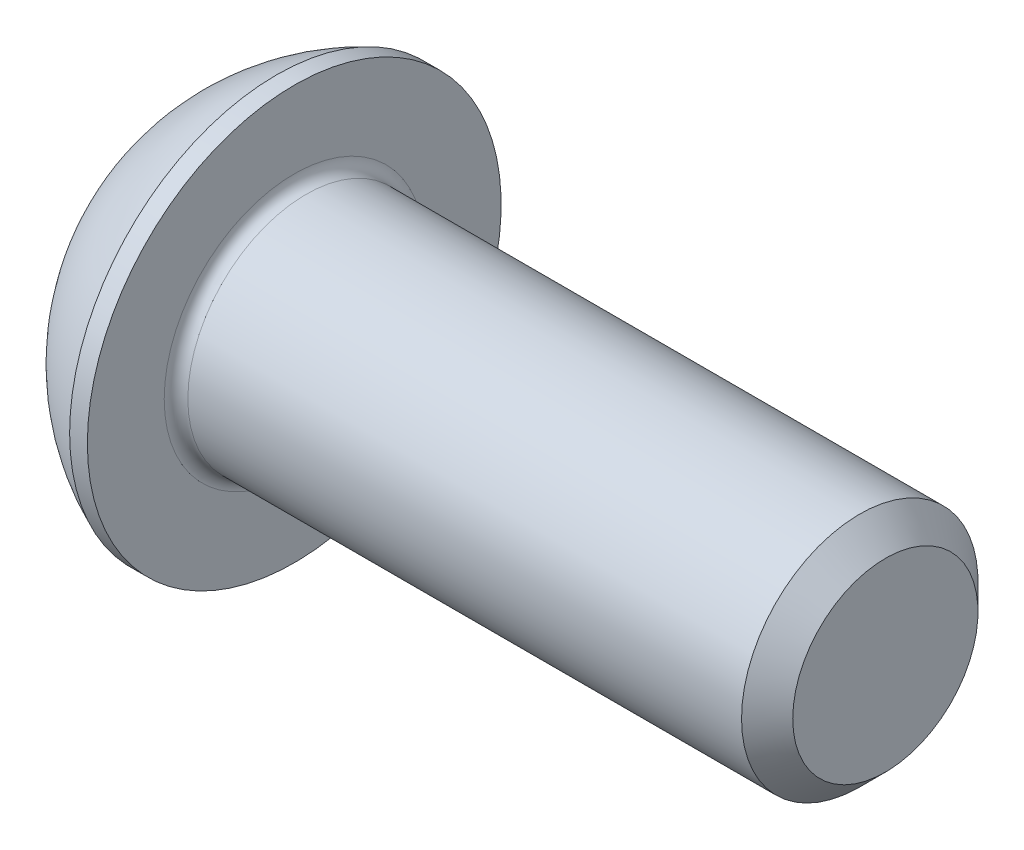
ISO-10303-21;
HEADER;
FILE_DESCRIPTION(('STEP AP214'),'2;1');
FILE_NAME('part.step','',(''),(''),'','','');
FILE_SCHEMA(('AUTOMOTIVE_DESIGN { 1 0 10303 214 1 1 1 1 }'));
ENDSEC;
DATA;
#1=APPLICATION_CONTEXT('core data for automotive mechanical design processes');
#2=APPLICATION_PROTOCOL_DEFINITION('international standard','automotive_design',2000,#1);
#3=PRODUCT_CONTEXT('',#1,'mechanical');
#4=PRODUCT('Part','Part','',(#3));
#5=PRODUCT_RELATED_PRODUCT_CATEGORY('part','',(#4));
#6=PRODUCT_DEFINITION_FORMATION('','',#4);
#7=PRODUCT_DEFINITION_CONTEXT('part definition',#1,'design');
#8=PRODUCT_DEFINITION('design','',#6,#7);
#9=PRODUCT_DEFINITION_SHAPE('','',#8);
#10=(LENGTH_UNIT() NAMED_UNIT(*) SI_UNIT(.MILLI.,.METRE.));
#11=(NAMED_UNIT(*) PLANE_ANGLE_UNIT() SI_UNIT($,.RADIAN.));
#12=(NAMED_UNIT(*) SI_UNIT($,.STERADIAN.) SOLID_ANGLE_UNIT());
#13=UNCERTAINTY_MEASURE_WITH_UNIT(LENGTH_MEASURE(1.E-05),#10,'distance_accuracy_value','');
#14=(GEOMETRIC_REPRESENTATION_CONTEXT(3) GLOBAL_UNCERTAINTY_ASSIGNED_CONTEXT((#13)) GLOBAL_UNIT_ASSIGNED_CONTEXT((#10,
#11,#12)) REPRESENTATION_CONTEXT('',''));
#15=CARTESIAN_POINT('',(0.,0.,0.));
#16=DIRECTION('',(0.,0.,1.));
#17=DIRECTION('',(1.,0.,0.));
#18=AXIS2_PLACEMENT_3D('',#15,#16,#17);
#19=CARTESIAN_POINT('',(0.,0.,0.));
#20=DIRECTION('',(-1.,0.,0.));
#21=DIRECTION('',(0.,0.,1.));
#22=AXIS2_PLACEMENT_3D('',#19,#20,#21);
#23=PLANE('',#22);
#24=CARTESIAN_POINT('',(0.,0.,0.));
#25=DIRECTION('',(-1.,0.,0.));
#26=DIRECTION('',(0.,0.,1.));
#27=AXIS2_PLACEMENT_3D('',#24,#25,#26);
#28=CIRCLE('',#27,0.875);
#29=CARTESIAN_POINT('',(0.,0.875,0.));
#30=VERTEX_POINT('',#29);
#31=EDGE_CURVE('E255',#30,#30,#28,.T.);
#32=ORIENTED_EDGE('',*,*,#31,.T.);
#33=EDGE_LOOP('',(#32));
#34=FACE_BOUND('',#33,.T.);
#35=CARTESIAN_POINT('',(0.,0.,0.));
#36=DIRECTION('',(-1.,0.,0.));
#37=DIRECTION('',(0.,0.,1.));
#38=AXIS2_PLACEMENT_3D('',#35,#36,#37);
#39=CIRCLE('',#38,0.715);
#40=CARTESIAN_POINT('',(0.,-0.711850222545951,0.0670392471711933));
#41=VERTEX_POINT('',#40);
#42=CARTESIAN_POINT('',(0.,-0.413982802373816,0.582960752828801));
#43=VERTEX_POINT('',#42);
#44=EDGE_CURVE('E238',#41,#43,#39,.T.);
#45=ORIENTED_EDGE('',*,*,#44,.F.);
#46=DIRECTION('',(0.,-0.499999999999998,-0.86602540378444));
#47=VECTOR('',#46,1.);
#48=CARTESIAN_POINT('',(0.,-0.750555349946509,0.));
#49=LINE('',#48,#47);
#50=CARTESIAN_POINT('',(0.,-0.750555349946509,0.));
#51=VERTEX_POINT('',#50);
#52=EDGE_CURVE('E436',#41,#51,#49,.T.);
#53=ORIENTED_EDGE('',*,*,#52,.T.);
#54=DIRECTION('',(0.,0.499999999999995,-0.866025403784441));
#55=VECTOR('',#54,1.);
#56=CARTESIAN_POINT('',(0.,-0.375277674973257,-0.65));
#57=LINE('',#56,#55);
#58=CARTESIAN_POINT('',(0.,-0.711850222545951,-0.0670392471711938));
#59=VERTEX_POINT('',#58);
#60=EDGE_CURVE('E188',#51,#59,#57,.T.);
#61=ORIENTED_EDGE('',*,*,#60,.T.);
#62=CARTESIAN_POINT('',(0.,-0.41398280237382,-0.582960752828798));
#63=VERTEX_POINT('',#62);
#64=EDGE_CURVE('E465',#63,#59,#39,.T.);
#65=ORIENTED_EDGE('',*,*,#64,.F.);
#66=CARTESIAN_POINT('',(0.,-0.375277674973257,-0.65));
#67=VERTEX_POINT('',#66);
#68=EDGE_CURVE('E435',#63,#67,#57,.T.);
#69=ORIENTED_EDGE('',*,*,#68,.T.);
#70=DIRECTION('',(0.,1.,0.));
#71=VECTOR('',#70,1.);
#72=CARTESIAN_POINT('',(0.,0.375277674973258,-0.65));
#73=LINE('',#72,#71);
#74=CARTESIAN_POINT('',(0.,-0.29786742017213,-0.65));
#75=VERTEX_POINT('',#74);
#76=EDGE_CURVE('E427',#67,#75,#73,.T.);
#77=ORIENTED_EDGE('',*,*,#76,.T.);
#78=CARTESIAN_POINT('',(0.,0.29786742017213,-0.65));
#79=VERTEX_POINT('',#78);
#80=EDGE_CURVE('E429',#79,#75,#39,.T.);
#81=ORIENTED_EDGE('',*,*,#80,.F.);
#82=CARTESIAN_POINT('',(0.,0.375277674973258,-0.65));
#83=VERTEX_POINT('',#82);
#84=EDGE_CURVE('E417',#79,#83,#73,.T.);
#85=ORIENTED_EDGE('',*,*,#84,.T.);
#86=DIRECTION('',(0.,0.499999999999999,0.866025403784439));
#87=VECTOR('',#86,1.);
#88=CARTESIAN_POINT('',(0.,0.750555349946514,0.));
#89=LINE('',#88,#87);
#90=CARTESIAN_POINT('',(0.,0.413982802373822,-0.582960752828797));
#91=VERTEX_POINT('',#90);
#92=EDGE_CURVE('E422',#83,#91,#89,.T.);
#93=ORIENTED_EDGE('',*,*,#92,.T.);
#94=CARTESIAN_POINT('',(0.,0.71185022254595,-0.0670392471712036));
#95=VERTEX_POINT('',#94);
#96=EDGE_CURVE('E467',#95,#91,#39,.T.);
#97=ORIENTED_EDGE('',*,*,#96,.F.);
#98=CARTESIAN_POINT('',(0.,0.750555349946514,0.));
#99=VERTEX_POINT('',#98);
#100=EDGE_CURVE('E424',#95,#99,#89,.T.);
#101=ORIENTED_EDGE('',*,*,#100,.T.);
#102=DIRECTION('',(0.,-0.500000000000001,0.866025403784438));
#103=VECTOR('',#102,1.);
#104=CARTESIAN_POINT('',(0.,0.375277674973258,0.649999999999998));
#105=LINE('',#104,#103);
#106=CARTESIAN_POINT('',(0.,0.71185022254595,0.0670392471712033));
#107=VERTEX_POINT('',#106);
#108=EDGE_CURVE('E407',#99,#107,#105,.T.);
#109=ORIENTED_EDGE('',*,*,#108,.T.);
#110=CARTESIAN_POINT('',(0.,0.41398280237382,0.582960752828798));
#111=VERTEX_POINT('',#110);
#112=EDGE_CURVE('E237',#111,#107,#39,.T.);
#113=ORIENTED_EDGE('',*,*,#112,.F.);
#114=CARTESIAN_POINT('',(0.,0.375277674973258,0.649999999999998));
#115=VERTEX_POINT('',#114);
#116=EDGE_CURVE('E403',#111,#115,#105,.T.);
#117=ORIENTED_EDGE('',*,*,#116,.T.);
#118=DIRECTION('',(0.,-1.,0.));
#119=VECTOR('',#118,1.);
#120=CARTESIAN_POINT('',(0.,-0.375277674973256,0.649999999999997));
#121=LINE('',#120,#119);
#122=CARTESIAN_POINT('',(0.,0.297867420172135,0.649999999999998));
#123=VERTEX_POINT('',#122);
#124=EDGE_CURVE('E176',#115,#123,#121,.T.);
#125=ORIENTED_EDGE('',*,*,#124,.T.);
#126=CARTESIAN_POINT('',(0.,-0.297867420172137,0.649999999999997));
#127=VERTEX_POINT('',#126);
#128=EDGE_CURVE('E234',#127,#123,#39,.T.);
#129=ORIENTED_EDGE('',*,*,#128,.F.);
#130=CARTESIAN_POINT('',(0.,-0.375277674973256,0.649999999999997));
#131=VERTEX_POINT('',#130);
#132=EDGE_CURVE('E401',#127,#131,#121,.T.);
#133=ORIENTED_EDGE('',*,*,#132,.T.);
#134=EDGE_CURVE('E434',#131,#43,#49,.T.);
#135=ORIENTED_EDGE('',*,*,#134,.T.);
#136=EDGE_LOOP('',(#45,#53,#61,#65,#69,#77,#81,#85,#93,#97,#101,#109,#113,#117,#125,#129,#133,#135));
#137=FACE_BOUND('',#136,.T.);
#138=ADVANCED_FACE('F41',(#34,#137),#23,.T.);
#139=CARTESIAN_POINT('',(0.,0.,0.));
#140=DIRECTION('',(-1.,0.,0.));
#141=DIRECTION('',(0.,0.,1.));
#142=AXIS2_PLACEMENT_3D('',#139,#140,#141);
#143=CYLINDRICAL_SURFACE('',#142,0.715);
#144=CARTESIAN_POINT('',(0.605,0.,0.));
#145=DIRECTION('',(-1.,0.,0.));
#146=DIRECTION('',(0.,0.,1.));
#147=AXIS2_PLACEMENT_3D('',#144,#145,#146);
#148=CIRCLE('',#147,0.715);
#149=CARTESIAN_POINT('',(0.605,-0.711850222545951,0.0670392471711933));
#150=VERTEX_POINT('',#149);
#151=CARTESIAN_POINT('',(0.605,-0.413982802373816,0.582960752828801));
#152=VERTEX_POINT('',#151);
#153=EDGE_CURVE('E459',#150,#152,#148,.T.);
#154=ORIENTED_EDGE('',*,*,#153,.F.);
#155=DIRECTION('',(-1.,0.,0.));
#156=VECTOR('',#155,1.);
#157=CARTESIAN_POINT('',(0.,-0.711850222545951,0.0670392471711937));
#158=LINE('',#157,#156);
#159=EDGE_CURVE('E173',#150,#41,#158,.T.);
#160=ORIENTED_EDGE('',*,*,#159,.T.);
#161=ORIENTED_EDGE('',*,*,#44,.T.);
#162=DIRECTION('',(-1.,0.,0.));
#163=VECTOR('',#162,1.);
#164=CARTESIAN_POINT('',(0.,-0.413982802373816,0.582960752828801));
#165=LINE('',#164,#163);
#166=EDGE_CURVE('E228',#43,#152,#165,.F.);
#167=ORIENTED_EDGE('',*,*,#166,.T.);
#168=EDGE_LOOP('',(#154,#160,#161,#167));
#169=FACE_BOUND('',#168,.T.);
#170=ADVANCED_FACE('F277',(#169),#143,.F.);
#171=CARTESIAN_POINT('',(0.605,-0.41398280237382,-0.582960752828798));
#172=VERTEX_POINT('',#171);
#173=CARTESIAN_POINT('',(0.605,-0.711850222545951,-0.0670392471711938));
#174=VERTEX_POINT('',#173);
#175=EDGE_CURVE('E455',#172,#174,#148,.T.);
#176=ORIENTED_EDGE('',*,*,#175,.F.);
#177=DIRECTION('',(-1.,0.,0.));
#178=VECTOR('',#177,1.);
#179=CARTESIAN_POINT('',(0.,-0.41398280237382,-0.582960752828798));
#180=LINE('',#179,#178);
#181=EDGE_CURVE('E222',#172,#63,#180,.T.);
#182=ORIENTED_EDGE('',*,*,#181,.T.);
#183=ORIENTED_EDGE('',*,*,#64,.T.);
#184=DIRECTION('',(-1.,0.,0.));
#185=VECTOR('',#184,1.);
#186=CARTESIAN_POINT('',(0.,-0.711850222545951,-0.0670392471711937));
#187=LINE('',#186,#185);
#188=EDGE_CURVE('E221',#59,#174,#187,.F.);
#189=ORIENTED_EDGE('',*,*,#188,.T.);
#190=EDGE_LOOP('',(#176,#182,#183,#189));
#191=FACE_BOUND('',#190,.T.);
#192=ADVANCED_FACE('F284',(#191),#143,.F.);
#193=CARTESIAN_POINT('',(0.605,0.29786742017213,-0.65));
#194=VERTEX_POINT('',#193);
#195=CARTESIAN_POINT('',(0.605,-0.29786742017213,-0.65));
#196=VERTEX_POINT('',#195);
#197=EDGE_CURVE('E453',#194,#196,#148,.T.);
#198=ORIENTED_EDGE('',*,*,#197,.F.);
#199=DIRECTION('',(-1.,0.,0.));
#200=VECTOR('',#199,1.);
#201=CARTESIAN_POINT('',(0.,0.29786742017213,-0.65));
#202=LINE('',#201,#200);
#203=EDGE_CURVE('E217',#194,#79,#202,.T.);
#204=ORIENTED_EDGE('',*,*,#203,.T.);
#205=ORIENTED_EDGE('',*,*,#80,.T.);
#206=DIRECTION('',(-1.,0.,0.));
#207=VECTOR('',#206,1.);
#208=CARTESIAN_POINT('',(0.,-0.29786742017213,-0.65));
#209=LINE('',#208,#207);
#210=EDGE_CURVE('E215',#75,#196,#209,.F.);
#211=ORIENTED_EDGE('',*,*,#210,.T.);
#212=EDGE_LOOP('',(#198,#204,#205,#211));
#213=FACE_BOUND('',#212,.T.);
#214=ADVANCED_FACE('F475',(#213),#143,.F.);
#215=CARTESIAN_POINT('',(0.605,0.71185022254595,-0.0670392471712036));
#216=VERTEX_POINT('',#215);
#217=CARTESIAN_POINT('',(0.605,0.413982802373822,-0.582960752828797));
#218=VERTEX_POINT('',#217);
#219=EDGE_CURVE('E375',#216,#218,#148,.T.);
#220=ORIENTED_EDGE('',*,*,#219,.F.);
#221=DIRECTION('',(-1.,0.,0.));
#222=VECTOR('',#221,1.);
#223=CARTESIAN_POINT('',(0.,0.71185022254595,-0.0670392471712036));
#224=LINE('',#223,#222);
#225=EDGE_CURVE('E212',#216,#95,#224,.T.);
#226=ORIENTED_EDGE('',*,*,#225,.T.);
#227=ORIENTED_EDGE('',*,*,#96,.T.);
#228=DIRECTION('',(-1.,0.,0.));
#229=VECTOR('',#228,1.);
#230=CARTESIAN_POINT('',(0.,0.413982802373822,-0.582960752828797));
#231=LINE('',#230,#229);
#232=EDGE_CURVE('E209',#91,#218,#231,.F.);
#233=ORIENTED_EDGE('',*,*,#232,.T.);
#234=EDGE_LOOP('',(#220,#226,#227,#233));
#235=FACE_BOUND('',#234,.T.);
#236=ADVANCED_FACE('F468',(#235),#143,.F.);
#237=CARTESIAN_POINT('',(0.605,0.41398280237382,0.582960752828798));
#238=VERTEX_POINT('',#237);
#239=CARTESIAN_POINT('',(0.605,0.71185022254595,0.0670392471712033));
#240=VERTEX_POINT('',#239);
#241=EDGE_CURVE('E232',#238,#240,#148,.T.);
#242=ORIENTED_EDGE('',*,*,#241,.F.);
#243=DIRECTION('',(-1.,0.,0.));
#244=VECTOR('',#243,1.);
#245=CARTESIAN_POINT('',(0.,0.41398280237382,0.582960752828798));
#246=LINE('',#245,#244);
#247=EDGE_CURVE('E207',#238,#111,#246,.T.);
#248=ORIENTED_EDGE('',*,*,#247,.T.);
#249=ORIENTED_EDGE('',*,*,#112,.T.);
#250=DIRECTION('',(-1.,0.,0.));
#251=VECTOR('',#250,1.);
#252=CARTESIAN_POINT('',(0.,0.71185022254595,0.0670392471712036));
#253=LINE('',#252,#251);
#254=EDGE_CURVE('E202',#107,#240,#253,.F.);
#255=ORIENTED_EDGE('',*,*,#254,.T.);
#256=EDGE_LOOP('',(#242,#248,#249,#255));
#257=FACE_BOUND('',#256,.T.);
#258=ADVANCED_FACE('F385',(#257),#143,.F.);
#259=CARTESIAN_POINT('',(0.605,-0.297867420172137,0.649999999999997));
#260=VERTEX_POINT('',#259);
#261=CARTESIAN_POINT('',(0.605,0.297867420172135,0.649999999999998));
#262=VERTEX_POINT('',#261);
#263=EDGE_CURVE('E229',#260,#262,#148,.T.);
#264=ORIENTED_EDGE('',*,*,#263,.F.);
#265=DIRECTION('',(-1.,0.,0.));
#266=VECTOR('',#265,1.);
#267=CARTESIAN_POINT('',(0.,-0.297867420172137,0.649999999999997));
#268=LINE('',#267,#266);
#269=EDGE_CURVE('E195',#260,#127,#268,.T.);
#270=ORIENTED_EDGE('',*,*,#269,.T.);
#271=ORIENTED_EDGE('',*,*,#128,.T.);
#272=DIRECTION('',(-1.,0.,0.));
#273=VECTOR('',#272,1.);
#274=CARTESIAN_POINT('',(0.,0.297867420172135,0.649999999999998));
#275=LINE('',#274,#273);
#276=EDGE_CURVE('E191',#123,#262,#275,.F.);
#277=ORIENTED_EDGE('',*,*,#276,.T.);
#278=EDGE_LOOP('',(#264,#270,#271,#277));
#279=FACE_BOUND('',#278,.T.);
#280=ADVANCED_FACE('F281',(#279),#143,.F.);
#281=CARTESIAN_POINT('',(1.68388157894737,0.,0.));
#282=DIRECTION('',(-1.,0.,0.));
#283=DIRECTION('',(0.,1.,0.));
#284=AXIS2_PLACEMENT_3D('',#281,#282,#283);
#285=SPHERICAL_SURFACE('',#284,1.89765175201308);
#286=CARTESIAN_POINT('',(0.95,0.,0.));
#287=DIRECTION('',(-1.,0.,0.));
#288=DIRECTION('',(0.,0.,1.));
#289=AXIS2_PLACEMENT_3D('',#286,#287,#288);
#290=CIRCLE('',#289,1.75);
#291=CARTESIAN_POINT('',(0.95,1.75,0.));
#292=VERTEX_POINT('',#291);
#293=EDGE_CURVE('E248',#292,#292,#290,.T.);
#294=CARTESIAN_POINT('',(0.95,1.75,0.));
#295=CARTESIAN_POINT('',(0.937340169559538,1.74469098940027,0.));
#296=CARTESIAN_POINT('',(0.924737968908448,1.73924455835412,0.));
#297=CARTESIAN_POINT('',(0.899654717595099,1.72807952164054,0.));
#298=CARTESIAN_POINT('',(0.887173666932838,1.7223609159731,0.));
#299=CARTESIAN_POINT('',(0.862338606007229,1.7106541962885,0.));
#300=CARTESIAN_POINT('',(0.849984595743881,1.70466608227132,0.));
#301=CARTESIAN_POINT('',(0.825409430903376,1.69242317344065,0.));
#302=CARTESIAN_POINT('',(0.81318827632622,1.68616837862716,0.));
#303=CARTESIAN_POINT('',(0.788884579669412,1.67339505215556,0.));
#304=CARTESIAN_POINT('',(0.77680203758976,1.66687652049746,0.));
#305=CARTESIAN_POINT('',(0.752781256357558,1.65357879096983,0.));
#306=CARTESIAN_POINT('',(0.740843017205007,1.64679959310029,0.));
#307=CARTESIAN_POINT('',(0.71711646458663,1.63298372389127,0.));
#308=CARTESIAN_POINT('',(0.705328151120803,1.6259470525518,0.));
#309=CARTESIAN_POINT('',(0.681907001944365,1.61161955058688,0.));
#310=CARTESIAN_POINT('',(0.670274166233754,1.60432871996143,0.));
#311=CARTESIAN_POINT('',(0.647169451430108,1.58949633326558,0.));
#312=CARTESIAN_POINT('',(0.635697572337074,1.58195477719518,0.));
#313=CARTESIAN_POINT('',(0.612920173817592,1.56662449155034,0.));
#314=CARTESIAN_POINT('',(0.601614654391145,1.55883576197591,0.));
#315=CARTESIAN_POINT('',(0.579175299902932,1.54301479767485,0.));
#316=CARTESIAN_POINT('',(0.568041464841166,1.53498256294822,0.));
#317=CARTESIAN_POINT('',(0.545950722919735,1.51867837138209,0.));
#318=CARTESIAN_POINT('',(0.534993816060069,1.51040641454259,0.));
#319=CARTESIAN_POINT('',(0.51326209105034,1.49362667469462,0.));
#320=CARTESIAN_POINT('',(0.502487272900276,1.48511889168615,0.));
#321=CARTESIAN_POINT('',(0.481124800056695,1.46787150651415,0.));
#322=CARTESIAN_POINT('',(0.470537145363177,1.45913190435061,0.));
#323=CARTESIAN_POINT('',(0.449553986028991,1.44142499706503,0.));
#324=CARTESIAN_POINT('',(0.439158481388324,1.43245769194298,0.));
#325=CARTESIAN_POINT('',(0.418564518256898,1.41429960218096,0.));
#326=CARTESIAN_POINT('',(0.408366059766139,1.40510881754099,0.));
#327=CARTESIAN_POINT('',(0.388170992226373,1.38650809743857,0.));
#328=CARTESIAN_POINT('',(0.378174383177366,1.37709816197613,0.));
#329=CARTESIAN_POINT('',(0.35838772274546,1.35806357214034,0.));
#330=CARTESIAN_POINT('',(0.348597671362561,1.348438917767,0.));
#331=CARTESIAN_POINT('',(0.32922873720226,1.32897942314977,0.));
#332=CARTESIAN_POINT('',(0.319649854424858,1.31914458290588,0.));
#333=CARTESIAN_POINT('',(0.30070776895829,1.29926934858169,0.));
#334=CARTESIAN_POINT('',(0.291344566269124,1.28922895450139,0.));
#335=CARTESIAN_POINT('',(0.272838250880315,1.26894734135071,0.));
#336=CARTESIAN_POINT('',(0.263695138180673,1.25870612228032,0.));
#337=CARTESIAN_POINT('',(0.245633309013679,1.2380276825808,0.));
#338=CARTESIAN_POINT('',(0.236714592546328,1.22759046195167,0.));
#339=CARTESIAN_POINT('',(0.219105756400304,1.20652493487909,0.));
#340=CARTESIAN_POINT('',(0.21041563672163,1.19589662843564,0.));
#341=CARTESIAN_POINT('',(0.193268087043462,1.17445393547738,0.));
#342=CARTESIAN_POINT('',(0.184810657043969,1.16363954896256,0.));
#343=CARTESIAN_POINT('',(0.168132470025252,1.14182978924308,0.));
#344=CARTESIAN_POINT('',(0.159911713006028,1.13083441603841,0.));
#345=CARTESIAN_POINT('',(0.143710743767988,1.10866786156894,0.));
#346=CARTESIAN_POINT('',(0.135730531549171,1.09749668030414,0.));
#347=CARTESIAN_POINT('',(0.120014410485326,1.07498377112164,0.));
#348=CARTESIAN_POINT('',(0.112278501640297,1.06364204320393,0.));
#349=CARTESIAN_POINT('',(0.0970546306648887,1.04079338254035,0.));
#350=CARTESIAN_POINT('',(0.0895666685345088,1.02928644979447,0.));
#351=CARTESIAN_POINT('',(0.0748422181852083,1.00611279876044,0.));
#352=CARTESIAN_POINT('',(0.0676057299662877,0.994446080472284,0.));
#353=CARTESIAN_POINT('',(0.0533876338292878,0.970958354192094,0.));
#354=CARTESIAN_POINT('',(0.0464060259112086,0.959137346200057,0.));
#355=CARTESIAN_POINT('',(0.0327009855576053,0.935346604180128,0.));
#356=CARTESIAN_POINT('',(0.0259775531220811,0.923376870152236,0.));
#357=CARTESIAN_POINT('',(0.0127920043413564,0.899294327831803,0.));
#358=CARTESIAN_POINT('',(0.00632988799615577,0.887181519539262,0.));
#359=CARTESIAN_POINT('',(0.,0.875,0.));
#360=B_SPLINE_CURVE_WITH_KNOTS('',3,(#294,#295,#296,#297,#298,#299,#300,#301,#302,#303,#304,
#305,#306,#307,#308,#309,#310,#311,#312,#313,#314,#315,#316,#317,#318,#319,#320,#321,#322,#323,
#324,#325,#326,#327,#328,#329,#330,#331,#332,#333,#334,#335,#336,#337,#338,#339,#340,#341,#342,
#343,#344,#345,#346,#347,#348,#349,#350,#351,#352,#353,#354,#355,#356,#357,#358,#359),
.UNSPECIFIED.,.F.,.F.,(4,2,2,2,2,2,2,2,2,2,2,2,2,2,2,2,2,2,2,2,2,2,2,2,2,2,2,2,2,2,2,2,4),(0.,
0.0411830717721068,0.0823661435442138,0.12354921531632,0.164732287088427,0.205915358860534,
0.247098430632641,0.288281502404748,0.329464574176855,0.370647645948962,0.411830717721068,
0.453013789493175,0.494196861265282,0.535379933037389,0.576563004809496,0.617746076581603,
0.658929148353709,0.700112220125816,0.741295291897923,0.78247836367003,0.823661435442137,
0.864844507214244,0.906027578986351,0.947210650758457,0.988393722530564,1.02957679430267,
1.07075986607478,1.11194293784688,1.15312600961899,1.1943090813911,1.23549215316321,
1.27667522493531,1.31785829670742),.UNSPECIFIED.);
#361=EDGE_CURVE('BSEAM287',#292,#30,#360,.T.);
#362=ORIENTED_EDGE('',*,*,#293,.T.);
#363=ORIENTED_EDGE('',*,*,#31,.F.);
#364=ORIENTED_EDGE('',*,*,#361,.T.);
#365=ORIENTED_EDGE('',*,*,#361,.F.);
#366=EDGE_LOOP('',(#362,#364,#363,#365));
#367=FACE_BOUND('',#366,.T.);
#368=ADVANCED_FACE('F287',(#367),#285,.T.);
#369=CARTESIAN_POINT('',(0.,0.,0.));
#370=DIRECTION('',(-1.,0.,0.));
#371=DIRECTION('',(0.,0.,1.));
#372=AXIS2_PLACEMENT_3D('',#369,#370,#371);
#373=CYLINDRICAL_SURFACE('',#372,1.75);
#374=ORIENTED_EDGE('',*,*,#293,.F.);
#375=EDGE_LOOP('',(#374));
#376=FACE_BOUND('',#375,.T.);
#377=CARTESIAN_POINT('',(1.1,0.,0.));
#378=DIRECTION('',(-1.,0.,0.));
#379=DIRECTION('',(0.,0.,1.));
#380=AXIS2_PLACEMENT_3D('',#377,#378,#379);
#381=CIRCLE('',#380,1.75);
#382=CARTESIAN_POINT('',(1.1,0.,1.75));
#383=VERTEX_POINT('',#382);
#384=EDGE_CURVE('E246',#383,#383,#381,.T.);
#385=ORIENTED_EDGE('',*,*,#384,.T.);
#386=EDGE_LOOP('',(#385));
#387=FACE_BOUND('',#386,.T.);
#388=ADVANCED_FACE('F293',(#376,#387),#373,.T.);
#389=CARTESIAN_POINT('',(1.1,0.999999999999992,0.));
#390=DIRECTION('',(-1.,0.,0.));
#391=DIRECTION('',(0.,0.,1.));
#392=AXIS2_PLACEMENT_3D('',#389,#390,#391);
#393=PLANE('',#392);
#394=CARTESIAN_POINT('',(1.1,0.,0.));
#395=DIRECTION('',(-1.,0.,0.));
#396=DIRECTION('',(0.,0.,1.));
#397=AXIS2_PLACEMENT_3D('',#394,#395,#396);
#398=CIRCLE('',#397,1.09999999999999);
#399=CARTESIAN_POINT('',(1.1,0.,1.09999999999999));
#400=VERTEX_POINT('',#399);
#401=EDGE_CURVE('E47',#400,#400,#398,.T.);
#402=ORIENTED_EDGE('',*,*,#401,.T.);
#403=EDGE_LOOP('',(#402));
#404=FACE_BOUND('',#403,.T.);
#405=ORIENTED_EDGE('',*,*,#384,.F.);
#406=EDGE_LOOP('',(#405));
#407=FACE_BOUND('',#406,.T.);
#408=ADVANCED_FACE('F257',(#404,#407),#393,.F.);
#409=CARTESIAN_POINT('',(0.,0.,0.));
#410=DIRECTION('',(-1.,0.,0.));
#411=DIRECTION('',(0.,0.,1.));
#412=AXIS2_PLACEMENT_3D('',#409,#410,#411);
#413=CYLINDRICAL_SURFACE('',#412,0.999999999999992);
#414=CARTESIAN_POINT('',(1.2,0.,0.));
#415=DIRECTION('',(-1.,0.,0.));
#416=DIRECTION('',(0.,0.,1.));
#417=AXIS2_PLACEMENT_3D('',#414,#415,#416);
#418=CIRCLE('',#417,0.999999999999992);
#419=CARTESIAN_POINT('',(1.2,0.,0.999999999999992));
#420=VERTEX_POINT('',#419);
#421=EDGE_CURVE('E11',#420,#420,#418,.F.);
#422=ORIENTED_EDGE('',*,*,#421,.T.);
#423=EDGE_LOOP('',(#422));
#424=FACE_BOUND('',#423,.T.);
#425=CARTESIAN_POINT('',(5.8835,0.,0.));
#426=DIRECTION('',(-1.,0.,0.));
#427=DIRECTION('',(0.,0.,1.));
#428=AXIS2_PLACEMENT_3D('',#425,#426,#427);
#429=CIRCLE('',#428,0.999999999999992);
#430=CARTESIAN_POINT('',(5.8835,0.,0.999999999999992));
#431=VERTEX_POINT('',#430);
#432=EDGE_CURVE('E243',#431,#431,#429,.T.);
#433=ORIENTED_EDGE('',*,*,#432,.T.);
#434=EDGE_LOOP('',(#433));
#435=FACE_BOUND('',#434,.T.);
#436=ADVANCED_FACE('F296',(#424,#435),#413,.T.);
#437=CARTESIAN_POINT('',(6.09999999999999,0.,0.));
#438=DIRECTION('',(-1.,0.,0.));
#439=DIRECTION('',(0.,0.,1.));
#440=AXIS2_PLACEMENT_3D('',#437,#438,#439);
#441=CONICAL_SURFACE('',#440,0.7835,0.785398163397442);
#442=ORIENTED_EDGE('',*,*,#432,.F.);
#443=EDGE_LOOP('',(#442));
#444=FACE_BOUND('',#443,.T.);
#445=CARTESIAN_POINT('',(6.09999999999999,0.,0.));
#446=DIRECTION('',(-1.,0.,0.));
#447=DIRECTION('',(0.,0.,1.));
#448=AXIS2_PLACEMENT_3D('',#445,#446,#447);
#449=CIRCLE('',#448,0.7835);
#450=CARTESIAN_POINT('',(6.09999999999999,0.,0.7835));
#451=VERTEX_POINT('',#450);
#452=EDGE_CURVE('E239',#451,#451,#449,.T.);
#453=ORIENTED_EDGE('',*,*,#452,.T.);
#454=EDGE_LOOP('',(#453));
#455=FACE_BOUND('',#454,.T.);
#456=ADVANCED_FACE('F271',(#444,#455),#441,.T.);
#457=CARTESIAN_POINT('',(6.09999999999999,0.,0.));
#458=DIRECTION('',(-1.,0.,0.));
#459=DIRECTION('',(0.,0.,1.));
#460=AXIS2_PLACEMENT_3D('',#457,#458,#459);
#461=PLANE('',#460);
#462=ORIENTED_EDGE('',*,*,#452,.F.);
#463=EDGE_LOOP('',(#462));
#464=FACE_BOUND('',#463,.T.);
#465=ADVANCED_FACE('F264',(#464),#461,.F.);
#466=CARTESIAN_POINT('',(1.2,0.,0.));
#467=DIRECTION('',(-1.,0.,0.));
#468=DIRECTION('',(0.,0.,1.));
#469=AXIS2_PLACEMENT_3D('',#466,#467,#468);
#470=TOROIDAL_SURFACE('',#469,1.09999999999999,0.1);
#471=ORIENTED_EDGE('',*,*,#421,.F.);
#472=EDGE_LOOP('',(#471));
#473=FACE_BOUND('',#472,.T.);
#474=ORIENTED_EDGE('',*,*,#401,.F.);
#475=EDGE_LOOP('',(#474));
#476=FACE_BOUND('',#475,.T.);
#477=ADVANCED_FACE('F43',(#473,#476),#470,.F.);
#478=CARTESIAN_POINT('',(1.01780544247059,0.,0.));
#479=DIRECTION('',(-1.,0.,0.));
#480=DIRECTION('',(0.,0.,1.));
#481=AXIS2_PLACEMENT_3D('',#478,#479,#480);
#482=CONICAL_SURFACE('',#481,0.,1.04719755119659);
#483=EDGE_CURVE('E233',#262,#238,#148,.T.);
#484=ORIENTED_EDGE('',*,*,#483,.T.);
#485=ORIENTED_EDGE('',*,*,#241,.T.);
#486=EDGE_CURVE('E362',#240,#216,#148,.T.);
#487=ORIENTED_EDGE('',*,*,#486,.T.);
#488=ORIENTED_EDGE('',*,*,#219,.T.);
#489=EDGE_CURVE('E458',#218,#194,#148,.T.);
#490=ORIENTED_EDGE('',*,*,#489,.T.);
#491=ORIENTED_EDGE('',*,*,#197,.T.);
#492=EDGE_CURVE('E451',#196,#172,#148,.T.);
#493=ORIENTED_EDGE('',*,*,#492,.T.);
#494=ORIENTED_EDGE('',*,*,#175,.T.);
#495=EDGE_CURVE('E185',#174,#150,#148,.T.);
#496=ORIENTED_EDGE('',*,*,#495,.T.);
#497=ORIENTED_EDGE('',*,*,#153,.T.);
#498=EDGE_CURVE('E460',#152,#260,#148,.T.);
#499=ORIENTED_EDGE('',*,*,#498,.T.);
#500=ORIENTED_EDGE('',*,*,#263,.T.);
#501=EDGE_LOOP('',(#484,#485,#487,#488,#490,#491,#493,#494,#496,#497,#499,#500));
#502=FACE_BOUND('',#501,.T.);
#503=CARTESIAN_POINT('',(1.01780544247059,0.,0.));
#504=VERTEX_POINT('',#503);
#505=VERTEX_LOOP('',#504);
#506=FACE_BOUND('',#505,.T.);
#507=ADVANCED_FACE('F263',(#502,#506),#482,.F.);
#508=CARTESIAN_POINT('',(0.605,-1.12583302491976,-0.65));
#509=DIRECTION('',(1.,0.,0.));
#510=DIRECTION('',(0.,0.,-1.));
#511=AXIS2_PLACEMENT_3D('',#508,#509,#510);
#512=PLANE('',#511);
#513=ORIENTED_EDGE('',*,*,#492,.F.);
#514=DIRECTION('',(0.,1.,0.));
#515=VECTOR('',#514,1.);
#516=CARTESIAN_POINT('',(0.605,0.375277674973258,-0.65));
#517=LINE('',#516,#515);
#518=CARTESIAN_POINT('',(0.605,-0.375277674973257,-0.65));
#519=VERTEX_POINT('',#518);
#520=EDGE_CURVE('E439',#519,#196,#517,.T.);
#521=ORIENTED_EDGE('',*,*,#520,.F.);
#522=DIRECTION('',(0.,0.499999999999995,-0.866025403784441));
#523=VECTOR('',#522,1.);
#524=CARTESIAN_POINT('',(0.605,-0.375277674973257,-0.65));
#525=LINE('',#524,#523);
#526=EDGE_CURVE('E187',#172,#519,#525,.T.);
#527=ORIENTED_EDGE('',*,*,#526,.F.);
#528=EDGE_LOOP('',(#513,#521,#527));
#529=FACE_BOUND('',#528,.T.);
#530=ADVANCED_FACE('F268',(#529),#512,.F.);
#531=CARTESIAN_POINT('',(0.605,0.375277674973258,-0.65));
#532=DIRECTION('',(0.,0.,1.));
#533=DIRECTION('',(1.,0.,0.));
#534=AXIS2_PLACEMENT_3D('',#531,#532,#533);
#535=PLANE('',#534);
#536=ORIENTED_EDGE('',*,*,#76,.F.);
#537=DIRECTION('',(-1.,0.,0.));
#538=VECTOR('',#537,1.);
#539=CARTESIAN_POINT('',(0.605,-0.375277674973257,-0.65));
#540=LINE('',#539,#538);
#541=EDGE_CURVE('E192',#519,#67,#540,.T.);
#542=ORIENTED_EDGE('',*,*,#541,.F.);
#543=ORIENTED_EDGE('',*,*,#520,.T.);
#544=ORIENTED_EDGE('',*,*,#210,.F.);
#545=EDGE_LOOP('',(#536,#542,#543,#544));
#546=FACE_BOUND('',#545,.T.);
#547=ADVANCED_FACE('F313',(#546),#535,.T.);
#548=CARTESIAN_POINT('',(0.605,-0.375277674973257,-0.65));
#549=DIRECTION('',(0.,0.866025403784441,0.499999999999995));
#550=DIRECTION('',(0.,-0.499999999999995,0.866025403784442));
#551=AXIS2_PLACEMENT_3D('',#548,#549,#550);
#552=PLANE('',#551);
#553=ORIENTED_EDGE('',*,*,#526,.T.);
#554=ORIENTED_EDGE('',*,*,#541,.T.);
#555=ORIENTED_EDGE('',*,*,#68,.F.);
#556=ORIENTED_EDGE('',*,*,#181,.F.);
#557=EDGE_LOOP('',(#553,#554,#555,#556));
#558=FACE_BOUND('',#557,.T.);
#559=ADVANCED_FACE('F312',(#558),#552,.T.);
#560=ORIENTED_EDGE('',*,*,#495,.F.);
#561=CARTESIAN_POINT('',(0.605,-0.750555349946509,0.));
#562=VERTEX_POINT('',#561);
#563=EDGE_CURVE('E177',#562,#174,#525,.T.);
#564=ORIENTED_EDGE('',*,*,#563,.F.);
#565=DIRECTION('',(0.,-0.499999999999998,-0.86602540378444));
#566=VECTOR('',#565,1.);
#567=CARTESIAN_POINT('',(0.605,-0.750555349946509,0.));
#568=LINE('',#567,#566);
#569=EDGE_CURVE('E63',#150,#562,#568,.T.);
#570=ORIENTED_EDGE('',*,*,#569,.F.);
#571=EDGE_LOOP('',(#560,#564,#570));
#572=FACE_BOUND('',#571,.T.);
#573=ADVANCED_FACE('F179',(#572),#512,.F.);
#574=ORIENTED_EDGE('',*,*,#60,.F.);
#575=DIRECTION('',(-1.,0.,0.));
#576=VECTOR('',#575,1.);
#577=CARTESIAN_POINT('',(0.605,-0.750555349946509,0.));
#578=LINE('',#577,#576);
#579=EDGE_CURVE('E167',#562,#51,#578,.T.);
#580=ORIENTED_EDGE('',*,*,#579,.F.);
#581=ORIENTED_EDGE('',*,*,#563,.T.);
#582=ORIENTED_EDGE('',*,*,#188,.F.);
#583=EDGE_LOOP('',(#574,#580,#581,#582));
#584=FACE_BOUND('',#583,.T.);
#585=ADVANCED_FACE('F189',(#584),#552,.T.);
#586=CARTESIAN_POINT('',(0.605,-0.750555349946509,0.));
#587=DIRECTION('',(0.,0.86602540378444,-0.499999999999998));
#588=DIRECTION('',(0.,0.499999999999998,0.86602540378444));
#589=AXIS2_PLACEMENT_3D('',#586,#587,#588);
#590=PLANE('',#589);
#591=ORIENTED_EDGE('',*,*,#569,.T.);
#592=ORIENTED_EDGE('',*,*,#579,.T.);
#593=ORIENTED_EDGE('',*,*,#52,.F.);
#594=ORIENTED_EDGE('',*,*,#159,.F.);
#595=EDGE_LOOP('',(#591,#592,#593,#594));
#596=FACE_BOUND('',#595,.T.);
#597=ADVANCED_FACE('F166',(#596),#590,.T.);
#598=ORIENTED_EDGE('',*,*,#498,.F.);
#599=CARTESIAN_POINT('',(0.605,-0.375277674973256,0.649999999999997));
#600=VERTEX_POINT('',#599);
#601=EDGE_CURVE('E174',#600,#152,#568,.T.);
#602=ORIENTED_EDGE('',*,*,#601,.F.);
#603=DIRECTION('',(0.,-1.,0.));
#604=VECTOR('',#603,1.);
#605=CARTESIAN_POINT('',(0.605,-0.375277674973256,0.649999999999997));
#606=LINE('',#605,#604);
#607=EDGE_CURVE('E57',#260,#600,#606,.T.);
#608=ORIENTED_EDGE('',*,*,#607,.F.);
#609=EDGE_LOOP('',(#598,#602,#608));
#610=FACE_BOUND('',#609,.T.);
#611=ADVANCED_FACE('F342',(#610),#512,.F.);
#612=CARTESIAN_POINT('',(0.605,-0.375277674973256,0.649999999999997));
#613=DIRECTION('',(0.,0.,-1.));
#614=DIRECTION('',(0.,1.,0.));
#615=AXIS2_PLACEMENT_3D('',#612,#613,#614);
#616=PLANE('',#615);
#617=ORIENTED_EDGE('',*,*,#607,.T.);
#618=DIRECTION('',(-1.,0.,0.));
#619=VECTOR('',#618,1.);
#620=CARTESIAN_POINT('',(0.605,-0.375277674973256,0.649999999999997));
#621=LINE('',#620,#619);
#622=EDGE_CURVE('E396',#600,#131,#621,.T.);
#623=ORIENTED_EDGE('',*,*,#622,.T.);
#624=ORIENTED_EDGE('',*,*,#132,.F.);
#625=ORIENTED_EDGE('',*,*,#269,.F.);
#626=EDGE_LOOP('',(#617,#623,#624,#625));
#627=FACE_BOUND('',#626,.T.);
#628=ADVANCED_FACE('F307',(#627),#616,.T.);
#629=ORIENTED_EDGE('',*,*,#134,.F.);
#630=ORIENTED_EDGE('',*,*,#622,.F.);
#631=ORIENTED_EDGE('',*,*,#601,.T.);
#632=ORIENTED_EDGE('',*,*,#166,.F.);
#633=EDGE_LOOP('',(#629,#630,#631,#632));
#634=FACE_BOUND('',#633,.T.);
#635=ADVANCED_FACE('F304',(#634),#590,.T.);
#636=ORIENTED_EDGE('',*,*,#483,.F.);
#637=CARTESIAN_POINT('',(0.605,0.375277674973258,0.649999999999998));
#638=VERTEX_POINT('',#637);
#639=EDGE_CURVE('E390',#638,#262,#606,.T.);
#640=ORIENTED_EDGE('',*,*,#639,.F.);
#641=DIRECTION('',(0.,-0.500000000000001,0.866025403784438));
#642=VECTOR('',#641,1.);
#643=CARTESIAN_POINT('',(0.605,0.375277674973258,0.649999999999998));
#644=LINE('',#643,#642);
#645=EDGE_CURVE('E380',#238,#638,#644,.T.);
#646=ORIENTED_EDGE('',*,*,#645,.F.);
#647=EDGE_LOOP('',(#636,#640,#646));
#648=FACE_BOUND('',#647,.T.);
#649=ADVANCED_FACE('F308',(#648),#512,.F.);
#650=ORIENTED_EDGE('',*,*,#124,.F.);
#651=DIRECTION('',(-1.,0.,0.));
#652=VECTOR('',#651,1.);
#653=CARTESIAN_POINT('',(0.605,0.375277674973258,0.649999999999998));
#654=LINE('',#653,#652);
#655=EDGE_CURVE('E391',#638,#115,#654,.T.);
#656=ORIENTED_EDGE('',*,*,#655,.F.);
#657=ORIENTED_EDGE('',*,*,#639,.T.);
#658=ORIENTED_EDGE('',*,*,#276,.F.);
#659=EDGE_LOOP('',(#650,#656,#657,#658));
#660=FACE_BOUND('',#659,.T.);
#661=ADVANCED_FACE('F331',(#660),#616,.T.);
#662=CARTESIAN_POINT('',(0.605,0.375277674973258,0.649999999999998));
#663=DIRECTION('',(0.,-0.866025403784438,-0.500000000000001));
#664=DIRECTION('',(0.,0.500000000000001,-0.866025403784438));
#665=AXIS2_PLACEMENT_3D('',#662,#663,#664);
#666=PLANE('',#665);
#667=ORIENTED_EDGE('',*,*,#645,.T.);
#668=ORIENTED_EDGE('',*,*,#655,.T.);
#669=ORIENTED_EDGE('',*,*,#116,.F.);
#670=ORIENTED_EDGE('',*,*,#247,.F.);
#671=EDGE_LOOP('',(#667,#668,#669,#670));
#672=FACE_BOUND('',#671,.T.);
#673=ADVANCED_FACE('F326',(#672),#666,.T.);
#674=ORIENTED_EDGE('',*,*,#486,.F.);
#675=CARTESIAN_POINT('',(0.605,0.750555349946514,0.));
#676=VERTEX_POINT('',#675);
#677=EDGE_CURVE('E370',#676,#240,#644,.T.);
#678=ORIENTED_EDGE('',*,*,#677,.F.);
#679=DIRECTION('',(0.,0.499999999999999,0.866025403784439));
#680=VECTOR('',#679,1.);
#681=CARTESIAN_POINT('',(0.605,0.750555349946514,0.));
#682=LINE('',#681,#680);
#683=EDGE_CURVE('E368',#216,#676,#682,.T.);
#684=ORIENTED_EDGE('',*,*,#683,.F.);
#685=EDGE_LOOP('',(#674,#678,#684));
#686=FACE_BOUND('',#685,.T.);
#687=ADVANCED_FACE('F327',(#686),#512,.F.);
#688=ORIENTED_EDGE('',*,*,#108,.F.);
#689=DIRECTION('',(-1.,0.,0.));
#690=VECTOR('',#689,1.);
#691=CARTESIAN_POINT('',(0.605,0.750555349946514,0.));
#692=LINE('',#691,#690);
#693=EDGE_CURVE('E376',#676,#99,#692,.T.);
#694=ORIENTED_EDGE('',*,*,#693,.F.);
#695=ORIENTED_EDGE('',*,*,#677,.T.);
#696=ORIENTED_EDGE('',*,*,#254,.F.);
#697=EDGE_LOOP('',(#688,#694,#695,#696));
#698=FACE_BOUND('',#697,.T.);
#699=ADVANCED_FACE('F325',(#698),#666,.T.);
#700=CARTESIAN_POINT('',(0.605,0.750555349946514,0.));
#701=DIRECTION('',(0.,-0.866025403784439,0.499999999999999));
#702=DIRECTION('',(0.,-0.499999999999999,-0.866025403784439));
#703=AXIS2_PLACEMENT_3D('',#700,#701,#702);
#704=PLANE('',#703);
#705=ORIENTED_EDGE('',*,*,#683,.T.);
#706=ORIENTED_EDGE('',*,*,#693,.T.);
#707=ORIENTED_EDGE('',*,*,#100,.F.);
#708=ORIENTED_EDGE('',*,*,#225,.F.);
#709=EDGE_LOOP('',(#705,#706,#707,#708));
#710=FACE_BOUND('',#709,.T.);
#711=ADVANCED_FACE('F323',(#710),#704,.T.);
#712=CARTESIAN_POINT('',(0.605,0.375277674973258,-0.65));
#713=VERTEX_POINT('',#712);
#714=EDGE_CURVE('E184',#194,#713,#517,.T.);
#715=ORIENTED_EDGE('',*,*,#714,.T.);
#716=DIRECTION('',(-1.,0.,0.));
#717=VECTOR('',#716,1.);
#718=CARTESIAN_POINT('',(0.605,0.375277674973258,-0.65));
#719=LINE('',#718,#717);
#720=EDGE_CURVE('E199',#713,#83,#719,.T.);
#721=ORIENTED_EDGE('',*,*,#720,.T.);
#722=ORIENTED_EDGE('',*,*,#84,.F.);
#723=ORIENTED_EDGE('',*,*,#203,.F.);
#724=EDGE_LOOP('',(#715,#721,#722,#723));
#725=FACE_BOUND('',#724,.T.);
#726=ADVANCED_FACE('F319',(#725),#535,.T.);
#727=ORIENTED_EDGE('',*,*,#489,.F.);
#728=EDGE_CURVE('E438',#713,#218,#682,.T.);
#729=ORIENTED_EDGE('',*,*,#728,.F.);
#730=ORIENTED_EDGE('',*,*,#714,.F.);
#731=EDGE_LOOP('',(#727,#729,#730));
#732=FACE_BOUND('',#731,.T.);
#733=ADVANCED_FACE('F322',(#732),#512,.F.);
#734=ORIENTED_EDGE('',*,*,#92,.F.);
#735=ORIENTED_EDGE('',*,*,#720,.F.);
#736=ORIENTED_EDGE('',*,*,#728,.T.);
#737=ORIENTED_EDGE('',*,*,#232,.F.);
#738=EDGE_LOOP('',(#734,#735,#736,#737));
#739=FACE_BOUND('',#738,.T.);
#740=ADVANCED_FACE('F316',(#739),#704,.T.);
#741=CLOSED_SHELL('',(#138,#170,#192,#214,#236,#258,#280,#368,#388,#408,#436,#456,#465,#477,
#507,#530,#547,#559,#573,#585,#597,#611,#628,#635,#649,#661,#673,#687,#699,#711,#726,#733,#740));
#742=MANIFOLD_SOLID_BREP('B2',#741);
#743=ADVANCED_BREP_SHAPE_REPRESENTATION('',(#18,#742),#14);
#744=SHAPE_DEFINITION_REPRESENTATION(#9,#743);
ENDSEC;
END-ISO-10303-21;
